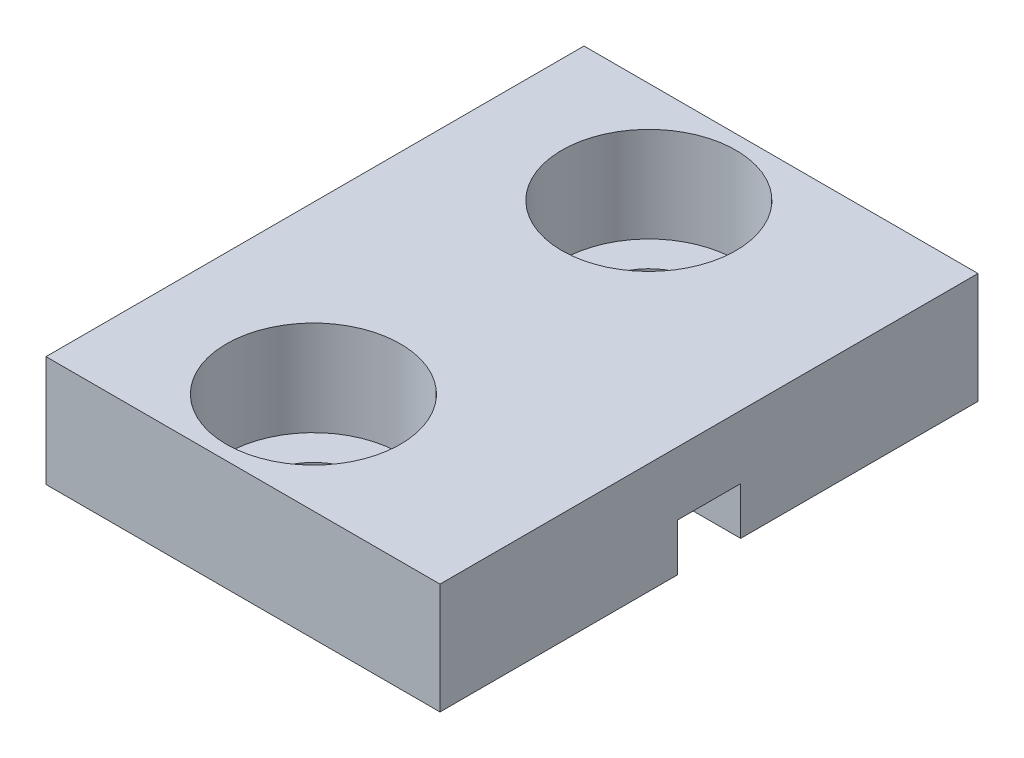
ISO-10303-21;
HEADER;
FILE_DESCRIPTION(('STEP AP214'),'2;1');
FILE_NAME('part.step','',(''),(''),'','','');
FILE_SCHEMA(('AUTOMOTIVE_DESIGN { 1 0 10303 214 1 1 1 1 }'));
ENDSEC;
DATA;
#1=APPLICATION_CONTEXT('core data for automotive mechanical design processes');
#2=APPLICATION_PROTOCOL_DEFINITION('international standard','automotive_design',2000,#1);
#3=PRODUCT_CONTEXT('',#1,'mechanical');
#4=PRODUCT('Part','Part','',(#3));
#5=PRODUCT_RELATED_PRODUCT_CATEGORY('part','',(#4));
#6=PRODUCT_DEFINITION_FORMATION('','',#4);
#7=PRODUCT_DEFINITION_CONTEXT('part definition',#1,'design');
#8=PRODUCT_DEFINITION('design','',#6,#7);
#9=PRODUCT_DEFINITION_SHAPE('','',#8);
#10=(LENGTH_UNIT() NAMED_UNIT(*) SI_UNIT(.MILLI.,.METRE.));
#11=(NAMED_UNIT(*) PLANE_ANGLE_UNIT() SI_UNIT($,.RADIAN.));
#12=(NAMED_UNIT(*) SI_UNIT($,.STERADIAN.) SOLID_ANGLE_UNIT());
#13=UNCERTAINTY_MEASURE_WITH_UNIT(LENGTH_MEASURE(1.E-05),#10,'distance_accuracy_value','');
#14=(GEOMETRIC_REPRESENTATION_CONTEXT(3) GLOBAL_UNCERTAINTY_ASSIGNED_CONTEXT((#13)) GLOBAL_UNIT_ASSIGNED_CONTEXT((#10,
#11,#12)) REPRESENTATION_CONTEXT('',''));
#15=CARTESIAN_POINT('',(0.,0.,0.));
#16=DIRECTION('',(0.,0.,1.));
#17=DIRECTION('',(1.,0.,0.));
#18=AXIS2_PLACEMENT_3D('',#15,#16,#17);
#19=CARTESIAN_POINT('',(0.,0.,0.));
#20=DIRECTION('',(0.,-1.,0.));
#21=DIRECTION('',(0.,0.,-1.));
#22=AXIS2_PLACEMENT_3D('',#19,#20,#21);
#23=PLANE('',#22);
#24=DIRECTION('',(0.,0.,-1.));
#25=VECTOR('',#24,1.);
#26=CARTESIAN_POINT('',(12.45,0.,0.));
#27=LINE('',#26,#25);
#28=CARTESIAN_POINT('',(12.45,0.,0.));
#29=VERTEX_POINT('',#28);
#30=CARTESIAN_POINT('',(12.45,0.,-7.5));
#31=VERTEX_POINT('',#30);
#32=EDGE_CURVE('E181',#29,#31,#27,.T.);
#33=ORIENTED_EDGE('',*,*,#32,.F.);
#34=DIRECTION('',(1.,0.,0.));
#35=VECTOR('',#34,1.);
#36=CARTESIAN_POINT('',(0.,0.,0.));
#37=LINE('',#36,#35);
#38=CARTESIAN_POINT('',(0.,0.,0.));
#39=VERTEX_POINT('',#38);
#40=EDGE_CURVE('E139',#39,#29,#37,.T.);
#41=ORIENTED_EDGE('',*,*,#40,.F.);
#42=DIRECTION('',(0.,0.,1.));
#43=VECTOR('',#42,1.);
#44=CARTESIAN_POINT('',(0.,0.,0.));
#45=LINE('',#44,#43);
#46=CARTESIAN_POINT('',(0.,0.,-7.5));
#47=VERTEX_POINT('',#46);
#48=EDGE_CURVE('E140',#47,#39,#45,.T.);
#49=ORIENTED_EDGE('',*,*,#48,.F.);
#50=DIRECTION('',(1.,0.,0.));
#51=VECTOR('',#50,1.);
#52=CARTESIAN_POINT('',(-5.5,0.,-7.5));
#53=LINE('',#52,#51);
#54=EDGE_CURVE('E195',#47,#31,#53,.T.);
#55=ORIENTED_EDGE('',*,*,#54,.T.);
#56=EDGE_LOOP('',(#33,#41,#49,#55));
#57=FACE_BOUND('',#56,.T.);
#58=CARTESIAN_POINT('',(5.25,0.,-3.2));
#59=DIRECTION('',(0.,1.,0.));
#60=DIRECTION('',(0.,0.,-1.));
#61=AXIS2_PLACEMENT_3D('',#58,#59,#60);
#62=CIRCLE('',#61,1.6);
#63=CARTESIAN_POINT('',(5.25,0.,-4.8));
#64=VERTEX_POINT('',#63);
#65=EDGE_CURVE('E152',#64,#64,#62,.T.);
#66=ORIENTED_EDGE('',*,*,#65,.T.);
#67=EDGE_LOOP('',(#66));
#68=FACE_BOUND('',#67,.T.);
#69=ADVANCED_FACE('F32',(#57,#68),#23,.T.);
#70=CARTESIAN_POINT('',(5.25,3.5,-13.8));
#71=DIRECTION('',(0.,-1.,0.));
#72=DIRECTION('',(0.,0.,-1.));
#73=AXIS2_PLACEMENT_3D('',#70,#71,#72);
#74=CYLINDRICAL_SURFACE('',#73,1.6);
#75=CARTESIAN_POINT('',(5.25,0.,-13.8));
#76=DIRECTION('',(0.,1.,0.));
#77=DIRECTION('',(0.,0.,1.));
#78=AXIS2_PLACEMENT_3D('',#75,#76,#77);
#79=CIRCLE('',#78,1.6);
#80=CARTESIAN_POINT('',(5.25,0.,-12.2));
#81=VERTEX_POINT('',#80);
#82=EDGE_CURVE('E156',#81,#81,#79,.T.);
#83=ORIENTED_EDGE('',*,*,#82,.F.);
#84=EDGE_LOOP('',(#83));
#85=FACE_BOUND('',#84,.T.);
#86=CARTESIAN_POINT('',(5.25,0.5,-13.8));
#87=DIRECTION('',(0.,1.,0.));
#88=DIRECTION('',(0.,0.,1.));
#89=AXIS2_PLACEMENT_3D('',#86,#87,#88);
#90=CIRCLE('',#89,1.6);
#91=CARTESIAN_POINT('',(5.25,0.5,-12.2));
#92=VERTEX_POINT('',#91);
#93=EDGE_CURVE('E149',#92,#92,#90,.T.);
#94=ORIENTED_EDGE('',*,*,#93,.T.);
#95=EDGE_LOOP('',(#94));
#96=FACE_BOUND('',#95,.T.);
#97=ADVANCED_FACE('F239',(#85,#96),#74,.F.);
#98=CARTESIAN_POINT('',(5.25,3.5,-3.2));
#99=DIRECTION('',(0.,-1.,0.));
#100=DIRECTION('',(0.,0.,-1.));
#101=AXIS2_PLACEMENT_3D('',#98,#99,#100);
#102=CYLINDRICAL_SURFACE('',#101,1.6);
#103=ORIENTED_EDGE('',*,*,#65,.F.);
#104=EDGE_LOOP('',(#103));
#105=FACE_BOUND('',#104,.T.);
#106=CARTESIAN_POINT('',(5.25,0.5,-3.2));
#107=DIRECTION('',(0.,1.,0.));
#108=DIRECTION('',(0.,0.,1.));
#109=AXIS2_PLACEMENT_3D('',#106,#107,#108);
#110=CIRCLE('',#109,1.6);
#111=CARTESIAN_POINT('',(5.25,0.5,-1.6));
#112=VERTEX_POINT('',#111);
#113=EDGE_CURVE('E147',#112,#112,#110,.T.);
#114=ORIENTED_EDGE('',*,*,#113,.T.);
#115=EDGE_LOOP('',(#114));
#116=FACE_BOUND('',#115,.T.);
#117=ADVANCED_FACE('F230',(#105,#116),#102,.F.);
#118=CARTESIAN_POINT('',(0.,3.5,0.));
#119=DIRECTION('',(0.,-1.,0.));
#120=DIRECTION('',(0.,0.,-1.));
#121=AXIS2_PLACEMENT_3D('',#118,#119,#120);
#122=PLANE('',#121);
#123=CARTESIAN_POINT('',(5.25,3.5,-13.8));
#124=DIRECTION('',(0.,1.,0.));
#125=DIRECTION('',(0.,0.,1.));
#126=AXIS2_PLACEMENT_3D('',#123,#124,#125);
#127=CIRCLE('',#126,2.75);
#128=CARTESIAN_POINT('',(5.25,3.5,-11.05));
#129=VERTEX_POINT('',#128);
#130=EDGE_CURVE('E217',#129,#129,#127,.T.);
#131=ORIENTED_EDGE('',*,*,#130,.F.);
#132=EDGE_LOOP('',(#131));
#133=FACE_BOUND('',#132,.T.);
#134=CARTESIAN_POINT('',(5.25,3.5,-3.2));
#135=DIRECTION('',(0.,1.,0.));
#136=DIRECTION('',(0.,0.,1.));
#137=AXIS2_PLACEMENT_3D('',#134,#135,#136);
#138=CIRCLE('',#137,2.75);
#139=CARTESIAN_POINT('',(5.25,3.5,-0.45));
#140=VERTEX_POINT('',#139);
#141=EDGE_CURVE('E163',#140,#140,#138,.T.);
#142=ORIENTED_EDGE('',*,*,#141,.F.);
#143=EDGE_LOOP('',(#142));
#144=FACE_BOUND('',#143,.T.);
#145=DIRECTION('',(1.,0.,0.));
#146=VECTOR('',#145,1.);
#147=CARTESIAN_POINT('',(0.,3.5,0.));
#148=LINE('',#147,#146);
#149=CARTESIAN_POINT('',(0.,3.5,0.));
#150=VERTEX_POINT('',#149);
#151=CARTESIAN_POINT('',(12.45,3.5,0.));
#152=VERTEX_POINT('',#151);
#153=EDGE_CURVE('E124',#150,#152,#148,.T.);
#154=ORIENTED_EDGE('',*,*,#153,.T.);
#155=DIRECTION('',(0.,0.,1.));
#156=VECTOR('',#155,1.);
#157=CARTESIAN_POINT('',(12.45,3.5,0.));
#158=LINE('',#157,#156);
#159=CARTESIAN_POINT('',(12.45,3.5,-17.));
#160=VERTEX_POINT('',#159);
#161=EDGE_CURVE('E109',#160,#152,#158,.T.);
#162=ORIENTED_EDGE('',*,*,#161,.F.);
#163=DIRECTION('',(-1.,0.,0.));
#164=VECTOR('',#163,1.);
#165=CARTESIAN_POINT('',(0.,3.5,-17.));
#166=LINE('',#165,#164);
#167=CARTESIAN_POINT('',(0.,3.5,-17.));
#168=VERTEX_POINT('',#167);
#169=EDGE_CURVE('E122',#160,#168,#166,.T.);
#170=ORIENTED_EDGE('',*,*,#169,.T.);
#171=DIRECTION('',(0.,0.,1.));
#172=VECTOR('',#171,1.);
#173=CARTESIAN_POINT('',(0.,3.5,0.));
#174=LINE('',#173,#172);
#175=EDGE_CURVE('E132',#168,#150,#174,.T.);
#176=ORIENTED_EDGE('',*,*,#175,.T.);
#177=EDGE_LOOP('',(#154,#162,#170,#176));
#178=FACE_BOUND('',#177,.T.);
#179=ADVANCED_FACE('F120',(#133,#144,#178),#122,.F.);
#180=DIRECTION('',(0.,0.,-1.));
#181=VECTOR('',#180,1.);
#182=CARTESIAN_POINT('',(12.45,0.,0.));
#183=LINE('',#182,#181);
#184=CARTESIAN_POINT('',(12.45,0.,-9.5));
#185=VERTEX_POINT('',#184);
#186=CARTESIAN_POINT('',(12.45,0.,-17.));
#187=VERTEX_POINT('',#186);
#188=EDGE_CURVE('E112',#185,#187,#183,.T.);
#189=ORIENTED_EDGE('',*,*,#188,.F.);
#190=DIRECTION('',(1.,0.,0.));
#191=VECTOR('',#190,1.);
#192=CARTESIAN_POINT('',(-5.5,0.,-9.5));
#193=LINE('',#192,#191);
#194=CARTESIAN_POINT('',(0.,0.,-9.5));
#195=VERTEX_POINT('',#194);
#196=EDGE_CURVE('E204',#195,#185,#193,.T.);
#197=ORIENTED_EDGE('',*,*,#196,.F.);
#198=CARTESIAN_POINT('',(0.,0.,-17.));
#199=VERTEX_POINT('',#198);
#200=EDGE_CURVE('E136',#199,#195,#45,.T.);
#201=ORIENTED_EDGE('',*,*,#200,.F.);
#202=DIRECTION('',(-1.,0.,0.));
#203=VECTOR('',#202,1.);
#204=CARTESIAN_POINT('',(0.,0.,-17.));
#205=LINE('',#204,#203);
#206=EDGE_CURVE('E143',#187,#199,#205,.T.);
#207=ORIENTED_EDGE('',*,*,#206,.F.);
#208=EDGE_LOOP('',(#189,#197,#201,#207));
#209=FACE_BOUND('',#208,.T.);
#210=ORIENTED_EDGE('',*,*,#82,.T.);
#211=EDGE_LOOP('',(#210));
#212=FACE_BOUND('',#211,.T.);
#213=ADVANCED_FACE('F229',(#209,#212),#23,.T.);
#214=CARTESIAN_POINT('',(0.,3.5,0.));
#215=DIRECTION('',(1.,0.,0.));
#216=DIRECTION('',(0.,0.,-1.));
#217=AXIS2_PLACEMENT_3D('',#214,#215,#216);
#218=PLANE('',#217);
#219=DIRECTION('',(0.,0.,1.));
#220=VECTOR('',#219,1.);
#221=CARTESIAN_POINT('',(0.,0.5,0.));
#222=LINE('',#221,#220);
#223=CARTESIAN_POINT('',(0.,0.5,-9.5));
#224=VERTEX_POINT('',#223);
#225=CARTESIAN_POINT('',(0.,0.5,-7.5));
#226=VERTEX_POINT('',#225);
#227=EDGE_CURVE('E211',#224,#226,#222,.T.);
#228=ORIENTED_EDGE('',*,*,#227,.T.);
#229=DIRECTION('',(0.,-1.,0.));
#230=VECTOR('',#229,1.);
#231=CARTESIAN_POINT('',(0.,3.49999999999999,-7.50000000000001));
#232=LINE('',#231,#230);
#233=EDGE_CURVE('E213',#226,#47,#232,.T.);
#234=ORIENTED_EDGE('',*,*,#233,.T.);
#235=ORIENTED_EDGE('',*,*,#48,.T.);
#236=DIRECTION('',(0.,-1.,0.));
#237=VECTOR('',#236,1.);
#238=CARTESIAN_POINT('',(0.,3.5,0.));
#239=LINE('',#238,#237);
#240=EDGE_CURVE('E40',#150,#39,#239,.T.);
#241=ORIENTED_EDGE('',*,*,#240,.F.);
#242=ORIENTED_EDGE('',*,*,#175,.F.);
#243=DIRECTION('',(0.,-1.,0.));
#244=VECTOR('',#243,1.);
#245=CARTESIAN_POINT('',(0.,3.5,-17.));
#246=LINE('',#245,#244);
#247=EDGE_CURVE('E128',#168,#199,#246,.T.);
#248=ORIENTED_EDGE('',*,*,#247,.T.);
#249=ORIENTED_EDGE('',*,*,#200,.T.);
#250=DIRECTION('',(0.,1.,0.));
#251=VECTOR('',#250,1.);
#252=CARTESIAN_POINT('',(0.,3.5,-9.5));
#253=LINE('',#252,#251);
#254=EDGE_CURVE('E200',#195,#224,#253,.T.);
#255=ORIENTED_EDGE('',*,*,#254,.T.);
#256=EDGE_LOOP('',(#228,#234,#235,#241,#242,#248,#249,#255));
#257=FACE_BOUND('',#256,.T.);
#258=ADVANCED_FACE('F34',(#257),#218,.F.);
#259=CARTESIAN_POINT('',(0.,3.5,0.));
#260=DIRECTION('',(0.,0.,-1.));
#261=DIRECTION('',(-1.,0.,0.));
#262=AXIS2_PLACEMENT_3D('',#259,#260,#261);
#263=PLANE('',#262);
#264=ORIENTED_EDGE('',*,*,#40,.T.);
#265=DIRECTION('',(0.,1.,0.));
#266=VECTOR('',#265,1.);
#267=CARTESIAN_POINT('',(12.45,-6.5,0.));
#268=LINE('',#267,#266);
#269=EDGE_CURVE('E116',#29,#152,#268,.T.);
#270=ORIENTED_EDGE('',*,*,#269,.T.);
#271=ORIENTED_EDGE('',*,*,#153,.F.);
#272=ORIENTED_EDGE('',*,*,#240,.T.);
#273=EDGE_LOOP('',(#264,#270,#271,#272));
#274=FACE_BOUND('',#273,.T.);
#275=ADVANCED_FACE('F172',(#274),#263,.F.);
#276=CARTESIAN_POINT('',(0.,3.5,-17.));
#277=DIRECTION('',(0.,0.,1.));
#278=DIRECTION('',(1.,0.,0.));
#279=AXIS2_PLACEMENT_3D('',#276,#277,#278);
#280=PLANE('',#279);
#281=ORIENTED_EDGE('',*,*,#169,.F.);
#282=DIRECTION('',(0.,1.,0.));
#283=VECTOR('',#282,1.);
#284=CARTESIAN_POINT('',(12.45,-6.5,-17.));
#285=LINE('',#284,#283);
#286=EDGE_CURVE('E106',#187,#160,#285,.T.);
#287=ORIENTED_EDGE('',*,*,#286,.F.);
#288=ORIENTED_EDGE('',*,*,#206,.T.);
#289=ORIENTED_EDGE('',*,*,#247,.F.);
#290=EDGE_LOOP('',(#281,#287,#288,#289));
#291=FACE_BOUND('',#290,.T.);
#292=ADVANCED_FACE('F126',(#291),#280,.F.);
#293=CARTESIAN_POINT('',(5.25,0.5,-3.2));
#294=DIRECTION('',(0.,1.,0.));
#295=DIRECTION('',(0.,0.,1.));
#296=AXIS2_PLACEMENT_3D('',#293,#294,#295);
#297=CYLINDRICAL_SURFACE('',#296,2.75);
#298=CARTESIAN_POINT('',(5.25,0.5,-3.2));
#299=DIRECTION('',(0.,1.,0.));
#300=DIRECTION('',(0.,0.,1.));
#301=AXIS2_PLACEMENT_3D('',#298,#299,#300);
#302=CIRCLE('',#301,2.75);
#303=CARTESIAN_POINT('',(5.25,0.5,-0.45));
#304=VERTEX_POINT('',#303);
#305=EDGE_CURVE('E219',#304,#304,#302,.T.);
#306=ORIENTED_EDGE('',*,*,#305,.F.);
#307=EDGE_LOOP('',(#306));
#308=FACE_BOUND('',#307,.T.);
#309=ORIENTED_EDGE('',*,*,#141,.T.);
#310=EDGE_LOOP('',(#309));
#311=FACE_BOUND('',#310,.T.);
#312=ADVANCED_FACE('F226',(#308,#311),#297,.F.);
#313=CARTESIAN_POINT('',(5.25,0.5,-3.2));
#314=DIRECTION('',(0.,1.,0.));
#315=DIRECTION('',(0.,0.,1.));
#316=AXIS2_PLACEMENT_3D('',#313,#314,#315);
#317=PLANE('',#316);
#318=ORIENTED_EDGE('',*,*,#113,.F.);
#319=EDGE_LOOP('',(#318));
#320=FACE_BOUND('',#319,.T.);
#321=ORIENTED_EDGE('',*,*,#305,.T.);
#322=EDGE_LOOP('',(#321));
#323=FACE_BOUND('',#322,.T.);
#324=ADVANCED_FACE('F340',(#320,#323),#317,.T.);
#325=CARTESIAN_POINT('',(5.25,0.5,-13.8));
#326=DIRECTION('',(0.,1.,0.));
#327=DIRECTION('',(0.,0.,1.));
#328=AXIS2_PLACEMENT_3D('',#325,#326,#327);
#329=CYLINDRICAL_SURFACE('',#328,2.75);
#330=CARTESIAN_POINT('',(5.25,0.5,-13.8));
#331=DIRECTION('',(0.,1.,0.));
#332=DIRECTION('',(0.,0.,1.));
#333=AXIS2_PLACEMENT_3D('',#330,#331,#332);
#334=CIRCLE('',#333,2.75);
#335=CARTESIAN_POINT('',(5.25,0.5,-11.05));
#336=VERTEX_POINT('',#335);
#337=EDGE_CURVE('E150',#336,#336,#334,.T.);
#338=ORIENTED_EDGE('',*,*,#337,.F.);
#339=EDGE_LOOP('',(#338));
#340=FACE_BOUND('',#339,.T.);
#341=ORIENTED_EDGE('',*,*,#130,.T.);
#342=EDGE_LOOP('',(#341));
#343=FACE_BOUND('',#342,.T.);
#344=ADVANCED_FACE('F336',(#340,#343),#329,.F.);
#345=CARTESIAN_POINT('',(5.25,0.5,-13.8));
#346=DIRECTION('',(0.,1.,0.));
#347=DIRECTION('',(0.,0.,1.));
#348=AXIS2_PLACEMENT_3D('',#345,#346,#347);
#349=PLANE('',#348);
#350=ORIENTED_EDGE('',*,*,#93,.F.);
#351=EDGE_LOOP('',(#350));
#352=FACE_BOUND('',#351,.T.);
#353=ORIENTED_EDGE('',*,*,#337,.T.);
#354=EDGE_LOOP('',(#353));
#355=FACE_BOUND('',#354,.T.);
#356=ADVANCED_FACE('F291',(#352,#355),#349,.T.);
#357=CARTESIAN_POINT('',(-5.5,0.,-7.5));
#358=DIRECTION('',(0.,0.,1.));
#359=DIRECTION('',(0.,-1.,0.));
#360=AXIS2_PLACEMENT_3D('',#357,#358,#359);
#361=PLANE('',#360);
#362=DIRECTION('',(-1.,0.,0.));
#363=VECTOR('',#362,1.);
#364=CARTESIAN_POINT('',(10.5,1.5,-7.5));
#365=LINE('',#364,#363);
#366=CARTESIAN_POINT('',(12.45,1.5,-7.5));
#367=VERTEX_POINT('',#366);
#368=CARTESIAN_POINT('',(7.5,1.5,-7.5));
#369=VERTEX_POINT('',#368);
#370=EDGE_CURVE('E183',#367,#369,#365,.T.);
#371=ORIENTED_EDGE('',*,*,#370,.F.);
#372=DIRECTION('',(0.,-1.,0.));
#373=VECTOR('',#372,1.);
#374=CARTESIAN_POINT('',(12.45,0.,-7.5));
#375=LINE('',#374,#373);
#376=EDGE_CURVE('E46',#367,#31,#375,.T.);
#377=ORIENTED_EDGE('',*,*,#376,.T.);
#378=ORIENTED_EDGE('',*,*,#54,.F.);
#379=ORIENTED_EDGE('',*,*,#233,.F.);
#380=DIRECTION('',(1.,0.,0.));
#381=VECTOR('',#380,1.);
#382=CARTESIAN_POINT('',(-5.5,0.5,-7.5));
#383=LINE('',#382,#381);
#384=CARTESIAN_POINT('',(7.5,0.5,-7.5));
#385=VERTEX_POINT('',#384);
#386=EDGE_CURVE('E197',#226,#385,#383,.T.);
#387=ORIENTED_EDGE('',*,*,#386,.T.);
#388=DIRECTION('',(0.,-1.,0.));
#389=VECTOR('',#388,1.);
#390=CARTESIAN_POINT('',(7.5,1.5,-7.5));
#391=LINE('',#390,#389);
#392=EDGE_CURVE('E191',#369,#385,#391,.T.);
#393=ORIENTED_EDGE('',*,*,#392,.F.);
#394=EDGE_LOOP('',(#371,#377,#378,#379,#387,#393));
#395=FACE_BOUND('',#394,.T.);
#396=ADVANCED_FACE('F286',(#395),#361,.F.);
#397=CARTESIAN_POINT('',(-5.5,0.5,-7.5));
#398=DIRECTION('',(0.,1.,0.));
#399=DIRECTION('',(0.,0.,1.));
#400=AXIS2_PLACEMENT_3D('',#397,#398,#399);
#401=PLANE('',#400);
#402=DIRECTION('',(1.,0.,0.));
#403=VECTOR('',#402,1.);
#404=CARTESIAN_POINT('',(-5.5,0.5,-9.5));
#405=LINE('',#404,#403);
#406=CARTESIAN_POINT('',(7.5,0.5,-9.5));
#407=VERTEX_POINT('',#406);
#408=EDGE_CURVE('E201',#224,#407,#405,.T.);
#409=ORIENTED_EDGE('',*,*,#408,.T.);
#410=DIRECTION('',(0.,0.,-1.));
#411=VECTOR('',#410,1.);
#412=CARTESIAN_POINT('',(7.5,0.5,-9.5));
#413=LINE('',#412,#411);
#414=EDGE_CURVE('E54',#385,#407,#413,.T.);
#415=ORIENTED_EDGE('',*,*,#414,.F.);
#416=ORIENTED_EDGE('',*,*,#386,.F.);
#417=ORIENTED_EDGE('',*,*,#227,.F.);
#418=EDGE_LOOP('',(#409,#415,#416,#417));
#419=FACE_BOUND('',#418,.T.);
#420=ADVANCED_FACE('F290',(#419),#401,.F.);
#421=CARTESIAN_POINT('',(-5.5,0.,-9.5));
#422=DIRECTION('',(0.,0.,-1.));
#423=DIRECTION('',(-1.,0.,0.));
#424=AXIS2_PLACEMENT_3D('',#421,#422,#423);
#425=PLANE('',#424);
#426=ORIENTED_EDGE('',*,*,#196,.T.);
#427=DIRECTION('',(0.,1.,0.));
#428=VECTOR('',#427,1.);
#429=CARTESIAN_POINT('',(12.45,0.,-9.5));
#430=LINE('',#429,#428);
#431=CARTESIAN_POINT('',(12.45,1.5,-9.5));
#432=VERTEX_POINT('',#431);
#433=EDGE_CURVE('E174',#185,#432,#430,.T.);
#434=ORIENTED_EDGE('',*,*,#433,.T.);
#435=DIRECTION('',(1.,0.,0.));
#436=VECTOR('',#435,1.);
#437=CARTESIAN_POINT('',(10.5,1.5,-9.5));
#438=LINE('',#437,#436);
#439=CARTESIAN_POINT('',(7.5,1.5,-9.5));
#440=VERTEX_POINT('',#439);
#441=EDGE_CURVE('E188',#440,#432,#438,.T.);
#442=ORIENTED_EDGE('',*,*,#441,.F.);
#443=DIRECTION('',(0.,-1.,0.));
#444=VECTOR('',#443,1.);
#445=CARTESIAN_POINT('',(7.5,1.5,-9.5));
#446=LINE('',#445,#444);
#447=EDGE_CURVE('E193',#440,#407,#446,.T.);
#448=ORIENTED_EDGE('',*,*,#447,.T.);
#449=ORIENTED_EDGE('',*,*,#408,.F.);
#450=ORIENTED_EDGE('',*,*,#254,.F.);
#451=EDGE_LOOP('',(#426,#434,#442,#448,#449,#450));
#452=FACE_BOUND('',#451,.T.);
#453=ADVANCED_FACE('F301',(#452),#425,.F.);
#454=CARTESIAN_POINT('',(7.5,1.5,-9.5));
#455=DIRECTION('',(-1.,0.,0.));
#456=DIRECTION('',(0.,0.,1.));
#457=AXIS2_PLACEMENT_3D('',#454,#455,#456);
#458=PLANE('',#457);
#459=ORIENTED_EDGE('',*,*,#414,.T.);
#460=ORIENTED_EDGE('',*,*,#447,.F.);
#461=DIRECTION('',(0.,0.,-1.));
#462=VECTOR('',#461,1.);
#463=CARTESIAN_POINT('',(7.5,1.5,-9.5));
#464=LINE('',#463,#462);
#465=EDGE_CURVE('E185',#369,#440,#464,.T.);
#466=ORIENTED_EDGE('',*,*,#465,.F.);
#467=ORIENTED_EDGE('',*,*,#392,.T.);
#468=EDGE_LOOP('',(#459,#460,#466,#467));
#469=FACE_BOUND('',#468,.T.);
#470=ADVANCED_FACE('F305',(#469),#458,.F.);
#471=CARTESIAN_POINT('',(0.,1.5,0.));
#472=DIRECTION('',(0.,-1.,0.));
#473=DIRECTION('',(0.,0.,-1.));
#474=AXIS2_PLACEMENT_3D('',#471,#472,#473);
#475=PLANE('',#474);
#476=DIRECTION('',(0.,0.,-1.));
#477=VECTOR('',#476,1.);
#478=CARTESIAN_POINT('',(12.45,1.5,0.));
#479=LINE('',#478,#477);
#480=EDGE_CURVE('E11',#367,#432,#479,.T.);
#481=ORIENTED_EDGE('',*,*,#480,.F.);
#482=ORIENTED_EDGE('',*,*,#370,.T.);
#483=ORIENTED_EDGE('',*,*,#465,.T.);
#484=ORIENTED_EDGE('',*,*,#441,.T.);
#485=EDGE_LOOP('',(#481,#482,#483,#484));
#486=FACE_BOUND('',#485,.T.);
#487=ADVANCED_FACE('F314',(#486),#475,.T.);
#488=CARTESIAN_POINT('',(12.45,-6.5,0.));
#489=DIRECTION('',(-1.,0.,0.));
#490=DIRECTION('',(0.,0.,1.));
#491=AXIS2_PLACEMENT_3D('',#488,#489,#490);
#492=PLANE('',#491);
#493=ORIENTED_EDGE('',*,*,#32,.T.);
#494=ORIENTED_EDGE('',*,*,#376,.F.);
#495=ORIENTED_EDGE('',*,*,#480,.T.);
#496=ORIENTED_EDGE('',*,*,#433,.F.);
#497=ORIENTED_EDGE('',*,*,#188,.T.);
#498=ORIENTED_EDGE('',*,*,#286,.T.);
#499=ORIENTED_EDGE('',*,*,#161,.T.);
#500=ORIENTED_EDGE('',*,*,#269,.F.);
#501=EDGE_LOOP('',(#493,#494,#495,#496,#497,#498,#499,#500));
#502=FACE_BOUND('',#501,.T.);
#503=ADVANCED_FACE('F108',(#502),#492,.F.);
#504=CLOSED_SHELL('',(#69,#97,#117,#179,#213,#258,#275,#292,#312,#324,#344,#356,#396,#420,#453,
#470,#487,#503));
#505=MANIFOLD_SOLID_BREP('B2',#504);
#506=ADVANCED_BREP_SHAPE_REPRESENTATION('',(#18,#505),#14);
#507=SHAPE_DEFINITION_REPRESENTATION(#9,#506);
ENDSEC;
END-ISO-10303-21;
